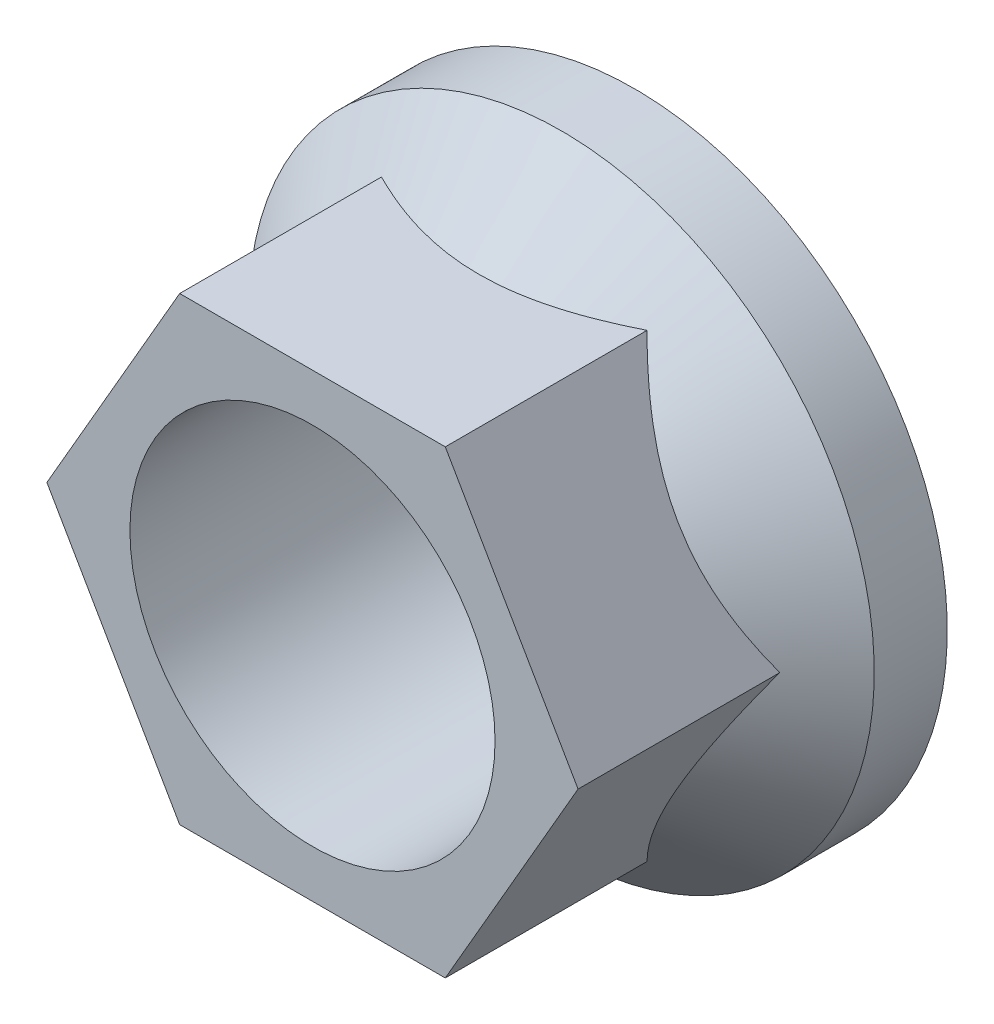
ISO-10303-21;
HEADER;
FILE_DESCRIPTION(('STEP AP214'),'2;1');
FILE_NAME('part.step','',(''),(''),'','','');
FILE_SCHEMA(('AUTOMOTIVE_DESIGN { 1 0 10303 214 1 1 1 1 }'));
ENDSEC;
DATA;
#1=APPLICATION_CONTEXT('core data for automotive mechanical design processes');
#2=APPLICATION_PROTOCOL_DEFINITION('international standard','automotive_design',2000,#1);
#3=PRODUCT_CONTEXT('',#1,'mechanical');
#4=PRODUCT('Part','Part','',(#3));
#5=PRODUCT_RELATED_PRODUCT_CATEGORY('part','',(#4));
#6=PRODUCT_DEFINITION_FORMATION('','',#4);
#7=PRODUCT_DEFINITION_CONTEXT('part definition',#1,'design');
#8=PRODUCT_DEFINITION('design','',#6,#7);
#9=PRODUCT_DEFINITION_SHAPE('','',#8);
#10=(LENGTH_UNIT() NAMED_UNIT(*) SI_UNIT(.MILLI.,.METRE.));
#11=(NAMED_UNIT(*) PLANE_ANGLE_UNIT() SI_UNIT($,.RADIAN.));
#12=(NAMED_UNIT(*) SI_UNIT($,.STERADIAN.) SOLID_ANGLE_UNIT());
#13=UNCERTAINTY_MEASURE_WITH_UNIT(LENGTH_MEASURE(1.E-05),#10,'distance_accuracy_value','');
#14=(GEOMETRIC_REPRESENTATION_CONTEXT(3) GLOBAL_UNCERTAINTY_ASSIGNED_CONTEXT((#13)) GLOBAL_UNIT_ASSIGNED_CONTEXT((#10,
#11,#12)) REPRESENTATION_CONTEXT('',''));
#15=CARTESIAN_POINT('',(0.,0.,0.));
#16=DIRECTION('',(0.,0.,1.));
#17=DIRECTION('',(1.,0.,0.));
#18=AXIS2_PLACEMENT_3D('',#15,#16,#17);
#19=CARTESIAN_POINT('',(0.,3.96875,7.));
#20=DIRECTION('',(0.,0.,1.));
#21=DIRECTION('',(1.,0.,0.));
#22=AXIS2_PLACEMENT_3D('',#19,#20,#21);
#23=PLANE('',#22);
#24=CARTESIAN_POINT('',(0.,0.,7.));
#25=DIRECTION('',(0.,0.,-1.));
#26=DIRECTION('',(-1.,0.,0.));
#27=AXIS2_PLACEMENT_3D('',#24,#25,#26);
#28=CIRCLE('',#27,3.96875);
#29=CARTESIAN_POINT('',(-3.96875,0.,7.));
#30=VERTEX_POINT('',#29);
#31=EDGE_CURVE('E134',#30,#30,#28,.T.);
#32=ORIENTED_EDGE('',*,*,#31,.T.);
#33=EDGE_LOOP('',(#32));
#34=FACE_BOUND('',#33,.T.);
#35=DIRECTION('',(-1.,0.,0.));
#36=VECTOR('',#35,1.);
#37=CARTESIAN_POINT('',(2.88675134594813,5.,7.));
#38=LINE('',#37,#36);
#39=CARTESIAN_POINT('',(2.88675134594813,5.,7.));
#40=VERTEX_POINT('',#39);
#41=CARTESIAN_POINT('',(-2.88675134594813,5.,7.));
#42=VERTEX_POINT('',#41);
#43=EDGE_CURVE('E90',#40,#42,#38,.T.);
#44=ORIENTED_EDGE('',*,*,#43,.T.);
#45=DIRECTION('',(-0.5,-0.866025403784439,0.));
#46=VECTOR('',#45,1.);
#47=CARTESIAN_POINT('',(-2.88675134594813,5.,7.));
#48=LINE('',#47,#46);
#49=CARTESIAN_POINT('',(-5.77350269189626,0.,7.));
#50=VERTEX_POINT('',#49);
#51=EDGE_CURVE('E99',#42,#50,#48,.T.);
#52=ORIENTED_EDGE('',*,*,#51,.T.);
#53=DIRECTION('',(0.5,-0.866025403784439,0.));
#54=VECTOR('',#53,1.);
#55=CARTESIAN_POINT('',(-5.77350269189626,0.,7.));
#56=LINE('',#55,#54);
#57=CARTESIAN_POINT('',(-2.88675134594813,-5.,7.));
#58=VERTEX_POINT('',#57);
#59=EDGE_CURVE('E104',#50,#58,#56,.T.);
#60=ORIENTED_EDGE('',*,*,#59,.T.);
#61=DIRECTION('',(1.,0.,0.));
#62=VECTOR('',#61,1.);
#63=CARTESIAN_POINT('',(-2.88675134594813,-5.,7.));
#64=LINE('',#63,#62);
#65=CARTESIAN_POINT('',(2.88675134594813,-5.,7.));
#66=VERTEX_POINT('',#65);
#67=EDGE_CURVE('E119',#58,#66,#64,.T.);
#68=ORIENTED_EDGE('',*,*,#67,.T.);
#69=DIRECTION('',(0.5,0.866025403784439,0.));
#70=VECTOR('',#69,1.);
#71=CARTESIAN_POINT('',(2.88675134594813,-5.,7.));
#72=LINE('',#71,#70);
#73=CARTESIAN_POINT('',(5.77350269189626,0.,7.));
#74=VERTEX_POINT('',#73);
#75=EDGE_CURVE('E122',#66,#74,#72,.T.);
#76=ORIENTED_EDGE('',*,*,#75,.T.);
#77=DIRECTION('',(-0.5,0.866025403784439,0.));
#78=VECTOR('',#77,1.);
#79=CARTESIAN_POINT('',(5.77350269189626,0.,7.));
#80=LINE('',#79,#78);
#81=EDGE_CURVE('E96',#74,#40,#80,.T.);
#82=ORIENTED_EDGE('',*,*,#81,.T.);
#83=EDGE_LOOP('',(#44,#52,#60,#68,#76,#82));
#84=FACE_BOUND('',#83,.T.);
#85=ADVANCED_FACE('F34',(#34,#84),#23,.T.);
#86=CARTESIAN_POINT('',(0.,0.,1.5875));
#87=DIRECTION('',(0.,0.,-1.));
#88=DIRECTION('',(-1.,0.,0.));
#89=AXIS2_PLACEMENT_3D('',#86,#87,#88);
#90=CONICAL_SURFACE('',#89,6.8,0.78539816339745);
#91=CARTESIAN_POINT('',(-5.7736181619501,-0.00019999999999992,2.61388183458587));
#92=CARTESIAN_POINT('',(-5.72398176110226,0.0857727681733075,2.66351376249948));
#93=CARTESIAN_POINT('',(-5.6739638280717,0.172406369471809,2.71162258281683));
#94=CARTESIAN_POINT('',(-5.57309004377304,0.34712488902884,2.80433067677396));
#95=CARTESIAN_POINT('',(-5.5222337529357,0.43521056864361,2.84892803360225));
#96=CARTESIAN_POINT('',(-5.367822577439,0.702658569860331,2.97713823597548));
#97=CARTESIAN_POINT('',(-5.26296050943972,0.88428499942183,3.05462224260221));
#98=CARTESIAN_POINT('',(-5.05149774994706,1.25054924277183,3.18730836367822));
#99=CARTESIAN_POINT('',(-4.94495110937142,1.43509343762461,3.2428447674579));
#100=CARTESIAN_POINT('',(-4.78337944338746,1.71494377217238,3.30708681405622));
#101=CARTESIAN_POINT('',(-4.72928433986568,1.8086392399128,3.3253151447651));
#102=CARTESIAN_POINT('',(-4.6206360917956,1.99682352572354,3.35500512097761));
#103=CARTESIAN_POINT('',(-4.56608301694086,2.09131222308106,3.36646777779865));
#104=CARTESIAN_POINT('',(-4.43314578685873,2.32156625980078,3.38568644635775));
#105=CARTESIAN_POINT('',(-4.35461839928598,2.45757968486243,3.38971901984402));
#106=CARTESIAN_POINT('',(-4.19770514602325,2.7293614118944,3.38295145399842));
#107=CARTESIAN_POINT('',(-4.11931933958609,2.86512961123583,3.37214611513274));
#108=CARTESIAN_POINT('',(-3.9632867222645,3.13538603207476,3.33633965820569));
#109=CARTESIAN_POINT('',(-3.88564083675503,3.26987265077585,3.31132266414547));
#110=CARTESIAN_POINT('',(-3.73168360440634,3.53653439939647,3.2484529831143));
#111=CARTESIAN_POINT('',(-3.65537215571135,3.66870970573538,3.21060128033617));
#112=CARTESIAN_POINT('',(-3.51990355411976,3.90334820652232,3.13272742134319));
#113=CARTESIAN_POINT('',(-3.46044647368859,4.0063308906988,3.09475305768471));
#114=CARTESIAN_POINT('',(-3.34259967462161,4.21044753419218,3.01268468192979));
#115=CARTESIAN_POINT('',(-3.28420998845894,4.31158143726392,2.96859048400018));
#116=CARTESIAN_POINT('',(-3.16868188148908,4.51168198823798,2.87527092275137));
#117=CARTESIAN_POINT('',(-3.11154017495448,4.61065432718709,2.82606169539434));
#118=CARTESIAN_POINT('',(-2.99831490663731,4.80676624461304,2.72315818526073));
#119=CARTESIAN_POINT('',(-2.94223072132829,4.90390690306938,2.66946665355471));
#120=CARTESIAN_POINT('',(-2.88663587589429,5.0002,2.61388183458587));
#121=B_SPLINE_CURVE_WITH_KNOTS('',3,(#91,#92,#93,#94,#95,#96,#97,#98,#99,#100,#101,#102,#103,
#104,#105,#106,#107,#108,#109,#110,#111,#112,#113,#114,#115,#116,#117,#118,#119,#120),
.UNSPECIFIED.,.F.,.F.,(4,2,2,2,2,2,2,2,2,2,2,2,2,2,4),(0.,0.332945616209568,0.666071736106991,
1.33592065243334,1.99513262597482,2.32409207808824,2.65300234563691,3.12358963991984,
3.59434188052354,4.06562104077027,4.53686407049611,4.91117956742317,5.2855064331967,
5.65868635377115,6.03163889109472),.UNSPECIFIED.);
#122=CARTESIAN_POINT('',(-5.77350269189626,0.,2.61399730810374));
#123=VERTEX_POINT('',#122);
#124=CARTESIAN_POINT('',(-2.88675134594813,5.,2.61399730810374));
#125=VERTEX_POINT('',#124);
#126=EDGE_CURVE('E138',#123,#125,#121,.T.);
#127=ORIENTED_EDGE('',*,*,#126,.T.);
#128=CARTESIAN_POINT('',(-7.20684268333673,5.,-0.383964043269181));
#129=CARTESIAN_POINT('',(-7.02533584783272,5.,-0.234871602398767));
#130=CARTESIAN_POINT('',(-6.84295884941852,5.,-0.0868218638032089));
#131=CARTESIAN_POINT('',(-6.47601907638765,5.,0.206637299933018));
#132=CARTESIAN_POINT('',(-6.29145575829076,5.,0.35204604480556));
#133=CARTESIAN_POINT('',(-5.91774347662376,5.,0.641175063616988));
#134=CARTESIAN_POINT('',(-5.72856639729863,5.,0.784859115566647));
#135=CARTESIAN_POINT('',(-5.34709488465153,5.,1.06800052762655));
#136=CARTESIAN_POINT('',(-5.15480075670416,5.,1.20745829798645));
#137=CARTESIAN_POINT('',(-4.74828785789455,5.,1.49377203808166));
#138=CARTESIAN_POINT('',(-4.53369778406278,5.,1.64010380565186));
#139=CARTESIAN_POINT('',(-4.09882280903799,5.,1.92427880652764));
#140=CARTESIAN_POINT('',(-3.87853606185851,5.,2.06211923804332));
#141=CARTESIAN_POINT('',(-3.43208969458754,5.,2.32557885644554));
#142=CARTESIAN_POINT('',(-3.20596216087672,5.,2.45125191150979));
#143=CARTESIAN_POINT('',(-2.7456402336395,5.,2.68667066325972));
#144=CARTESIAN_POINT('',(-2.51145309302816,5.,2.79643023966708));
#145=CARTESIAN_POINT('',(-2.10332797090163,5.,2.96529770024876));
#146=CARTESIAN_POINT('',(-1.93166126919297,5.,3.02985543617625));
#147=CARTESIAN_POINT('',(-1.5836731379951,5.,3.14525890409372));
#148=CARTESIAN_POINT('',(-1.40735104713127,5.,3.1961026761562));
#149=CARTESIAN_POINT('',(-1.05421412357262,5.,3.28038821967951));
#150=CARTESIAN_POINT('',(-0.877478089032206,5.,3.31415444612165));
#151=CARTESIAN_POINT('',(-0.521464449999362,5.,3.36346766636841));
#152=CARTESIAN_POINT('',(-0.342187457595268,5.,3.37901897491136));
#153=CARTESIAN_POINT('',(0.00824609668831101,5.,3.39041051498121));
#154=CARTESIAN_POINT('',(0.179372606687934,5.,3.38717443039007));
#155=CARTESIAN_POINT('',(0.520399004844326,5.,3.36337145447053));
#156=CARTESIAN_POINT('',(0.690298849003054,5.,3.34280394458272));
#157=CARTESIAN_POINT('',(1.0287130005671,5.,3.28552175283438));
#158=CARTESIAN_POINT('',(1.19720505930835,5.,3.24867809251528));
#159=CARTESIAN_POINT('',(1.53047572651633,5.,3.16098339628438));
#160=CARTESIAN_POINT('',(1.69525363009853,5.,3.11012972532152));
#161=CARTESIAN_POINT('',(2.02014513075725,5.,2.99696570970446));
#162=CARTESIAN_POINT('',(2.18027266869218,5.,2.93469486248416));
#163=CARTESIAN_POINT('',(2.49655833978531,5.,2.80070603826635));
#164=CARTESIAN_POINT('',(2.65271487839687,5.,2.72898433558749));
#165=CARTESIAN_POINT('',(2.96150057332792,5.,2.57782421611012));
#166=CARTESIAN_POINT('',(3.11412423256131,5.,2.49837465894926));
#167=CARTESIAN_POINT('',(3.41597100743156,5.,2.33333668834199));
#168=CARTESIAN_POINT('',(3.5651945226723,5.,2.24774900123765));
#169=CARTESIAN_POINT('',(3.86264486278974,5.,2.07041370144223));
#170=CARTESIAN_POINT('',(4.01083137662813,5.,1.9785987896325));
#171=CARTESIAN_POINT('',(4.30453975295172,5.,1.79081021954944));
#172=CARTESIAN_POINT('',(4.450061554748,5.,1.69483646672549));
#173=CARTESIAN_POINT('',(4.73865434683265,5.,1.49957076621414));
#174=CARTESIAN_POINT('',(4.88172752266474,5.,1.40028203909378));
#175=CARTESIAN_POINT('',(5.16586578389749,5.,1.19888884074802));
#176=CARTESIAN_POINT('',(5.30693093866263,5.,1.0967844671451));
#177=CARTESIAN_POINT('',(5.59870626887491,5.,0.881835473508126));
#178=CARTESIAN_POINT('',(5.74926965373197,5.,0.768791903592957));
#179=CARTESIAN_POINT('',(6.04864866788352,5.,0.540411100317346));
#180=CARTESIAN_POINT('',(6.19746425249832,5.,0.425073808523728));
#181=CARTESIAN_POINT('',(6.64168716046466,5.,0.0761658869699936));
#182=CARTESIAN_POINT('',(6.93483878765855,5.,-0.160277077832388));
#183=CARTESIAN_POINT('',(7.5167127425952,5.,-0.638776003833525));
#184=CARTESIAN_POINT('',(7.8054330793097,5.,-0.880834372114013));
#185=CARTESIAN_POINT('',(8.37936241548021,5.,-1.36908626381488));
#186=CARTESIAN_POINT('',(8.66457132332548,5.,-1.61527989472686));
#187=CARTESIAN_POINT('',(9.23282971432231,5.,-2.11135330652402));
#188=CARTESIAN_POINT('',(9.51587331080528,5.,-2.36123981658115));
#189=CARTESIAN_POINT('',(10.0797503356248,5.,-2.86349804759497));
#190=CARTESIAN_POINT('',(10.3605837365856,5.,-3.11586979924743));
#191=CARTESIAN_POINT('',(10.920382245605,5.,-3.62252028115007));
#192=CARTESIAN_POINT('',(11.1993478479639,5.,-3.87679846579686));
#193=CARTESIAN_POINT('',(11.755810505856,5.,-4.38695739484843));
#194=CARTESIAN_POINT('',(12.0333075558994,5.,-4.64283814523622));
#195=CARTESIAN_POINT('',(12.8012247838068,5.,-5.35429995427943));
#196=CARTESIAN_POINT('',(13.2903452503295,5.,-5.81128360107441));
#197=CARTESIAN_POINT('',(14.2658249043522,5.,-6.7282608026559));
#198=CARTESIAN_POINT('',(14.7521838690041,5.,-7.18825459408499));
#199=CARTESIAN_POINT('',(15.7208582314195,5.,-8.10863801113465));
#200=CARTESIAN_POINT('',(16.2031820166547,5.,-8.56901881612833));
#201=CARTESIAN_POINT('',(17.1661285582923,5.,-9.4914643599497));
#202=CARTESIAN_POINT('',(17.6467514732382,5.,-9.95352893321876));
#203=CARTESIAN_POINT('',(18.1267697042408,5.,-10.4162171833279));
#204=B_SPLINE_CURVE_WITH_KNOTS('',3,(#128,#129,#130,#131,#132,#133,#134,#135,#136,#137,#138,
#139,#140,#141,#142,#143,#144,#145,#146,#147,#148,#149,#150,#151,#152,#153,#154,#155,#156,#157,
#158,#159,#160,#161,#162,#163,#164,#165,#166,#167,#168,#169,#170,#171,#172,#173,#174,#175,#176,
#177,#178,#179,#180,#181,#182,#183,#184,#185,#186,#187,#188,#189,#190,#191,#192,#193,#194,#195,
#196,#197,#198,#199,#200,#201,#202,#203),.UNSPECIFIED.,.F.,.F.,(4,2,2,2,2,2,2,2,2,2,2,2,2,2,2,2,
2,2,2,2,2,2,2,2,2,2,2,2,2,2,2,2,2,2,2,2,2,4),(0.,0.704681621091579,1.40954225127929,
2.12216418418013,2.83471671908357,3.61376913385487,4.39307724186671,5.16876015340873,
5.94376239165213,6.4935186872698,7.04335350958292,7.58230774197345,8.12113428138719,
8.63370109577989,9.14628620448172,9.66300820682658,10.1798274624543,10.6948914210485,
11.210159037123,11.7261807862798,12.2421415735738,12.765032827809,13.2879359761415,
13.8103451056244,14.3327361451554,14.8975398871074,15.4623580360636,16.5921134146673,
17.7223623617099,18.8526407339384,19.9853242974614,21.1180218685947,22.25040678606,
23.3827959336859,25.3909239343666,27.3992117474587,29.3995270305069,31.3996506691803),.UNSPECIFIED.);
#205=CARTESIAN_POINT('',(2.88675134594813,5.,2.61399730810374));
#206=VERTEX_POINT('',#205);
#207=EDGE_CURVE('E92',#125,#206,#204,.T.);
#208=ORIENTED_EDGE('',*,*,#207,.T.);
#209=CARTESIAN_POINT('',(2.88663587589429,5.0002,2.61388183458587));
#210=CARTESIAN_POINT('',(2.93627227674213,4.91422723182669,2.66351376249948));
#211=CARTESIAN_POINT('',(2.98629020977269,4.82759363052819,2.71162258281683));
#212=CARTESIAN_POINT('',(3.08716399407135,4.65287511097116,2.80433067677396));
#213=CARTESIAN_POINT('',(3.13802028490869,4.56478943135639,2.84892803360225));
#214=CARTESIAN_POINT('',(3.29243146040539,4.29734143013967,2.97713823597548));
#215=CARTESIAN_POINT('',(3.39729352840467,4.11571500057817,3.05462224260221));
#216=CARTESIAN_POINT('',(3.60875628789733,3.74945075722818,3.18730836367822));
#217=CARTESIAN_POINT('',(3.71530292847296,3.56490656237539,3.2428447674579));
#218=CARTESIAN_POINT('',(3.87687459445693,3.28505622782762,3.30708681405622));
#219=CARTESIAN_POINT('',(3.93096969797871,3.1913607600872,3.3253151447651));
#220=CARTESIAN_POINT('',(4.03961794604879,3.00317647427647,3.35500512097761));
#221=CARTESIAN_POINT('',(4.09417102090353,2.90868777691895,3.36646777779865));
#222=CARTESIAN_POINT('',(4.22710825098566,2.67843374019922,3.38568644635775));
#223=CARTESIAN_POINT('',(4.30563563855841,2.54242031513757,3.38971901984402));
#224=CARTESIAN_POINT('',(4.46254889182114,2.2706385881056,3.38295145399842));
#225=CARTESIAN_POINT('',(4.5409346982583,2.13487038876417,3.37214611513273));
#226=CARTESIAN_POINT('',(4.69696731557988,1.86461396792524,3.33633965820569));
#227=CARTESIAN_POINT('',(4.77461320108936,1.73012734922415,3.31132266414547));
#228=CARTESIAN_POINT('',(4.92857043343805,1.46346560060353,3.2484529831143));
#229=CARTESIAN_POINT('',(5.00488188213304,1.33129029426463,3.21060128033617));
#230=CARTESIAN_POINT('',(5.14035048372463,1.09665179347768,3.13272742134319));
#231=CARTESIAN_POINT('',(5.1998075641558,0.993669109301201,3.09475305768471));
#232=CARTESIAN_POINT('',(5.31765436322278,0.789552465807827,3.01268468192979));
#233=CARTESIAN_POINT('',(5.37604404938545,0.688418562736079,2.96859048400018));
#234=CARTESIAN_POINT('',(5.49157215635531,0.488318011762025,2.87527092275137));
#235=CARTESIAN_POINT('',(5.54871386288991,0.389345672812909,2.82606169539434));
#236=CARTESIAN_POINT('',(5.66193913120708,0.193233755386958,2.72315818526073));
#237=CARTESIAN_POINT('',(5.7180233165161,0.0960930969306195,2.66946665355471));
#238=CARTESIAN_POINT('',(5.7736181619501,-0.000199999999998285,2.61388183458587));
#239=B_SPLINE_CURVE_WITH_KNOTS('',3,(#209,#210,#211,#212,#213,#214,#215,#216,#217,#218,#219,
#220,#221,#222,#223,#224,#225,#226,#227,#228,#229,#230,#231,#232,#233,#234,#235,#236,#237,#238),
.UNSPECIFIED.,.F.,.F.,(4,2,2,2,2,2,2,2,2,2,2,2,2,2,4),(0.,0.332945616209567,0.666071736106991,
1.33592065243334,1.99513262597481,2.32409207808824,2.65300234563691,3.12358963991983,
3.59434188052354,4.06562104077027,4.53686407049611,4.91117956742317,5.2855064331967,
5.65868635377115,6.03163889109472),.UNSPECIFIED.);
#240=CARTESIAN_POINT('',(5.77350269189626,0.,2.61399730810374));
#241=VERTEX_POINT('',#240);
#242=EDGE_CURVE('E209',#206,#241,#239,.T.);
#243=ORIENTED_EDGE('',*,*,#242,.T.);
#244=CARTESIAN_POINT('',(5.7736181619501,0.000200000000001849,2.61388183458587));
#245=CARTESIAN_POINT('',(5.72398176110226,-0.0857727681733054,2.66351376249948));
#246=CARTESIAN_POINT('',(5.6739638280717,-0.172406369471807,2.71162258281683));
#247=CARTESIAN_POINT('',(5.57309004377304,-0.347124889028838,2.80433067677396));
#248=CARTESIAN_POINT('',(5.5222337529357,-0.435210568643608,2.84892803360225));
#249=CARTESIAN_POINT('',(5.367822577439,-0.702658569860329,2.97713823597548));
#250=CARTESIAN_POINT('',(5.26296050943972,-0.884284999421828,3.05462224260222));
#251=CARTESIAN_POINT('',(5.05149774994706,-1.25054924277182,3.18730836367822));
#252=CARTESIAN_POINT('',(4.94495110937142,-1.43509343762461,3.2428447674579));
#253=CARTESIAN_POINT('',(4.78337944338746,-1.71494377217238,3.30708681405622));
#254=CARTESIAN_POINT('',(4.72928433986568,-1.8086392399128,3.3253151447651));
#255=CARTESIAN_POINT('',(4.6206360917956,-1.99682352572353,3.35500512097761));
#256=CARTESIAN_POINT('',(4.56608301694086,-2.09131222308105,3.36646777779865));
#257=CARTESIAN_POINT('',(4.43314578685873,-2.32156625980078,3.38568644635775));
#258=CARTESIAN_POINT('',(4.35461839928598,-2.45757968486243,3.38971901984402));
#259=CARTESIAN_POINT('',(4.19770514602325,-2.7293614118944,3.38295145399842));
#260=CARTESIAN_POINT('',(4.11931933958609,-2.86512961123582,3.37214611513274));
#261=CARTESIAN_POINT('',(3.9632867222645,-3.13538603207476,3.3363396582057));
#262=CARTESIAN_POINT('',(3.88564083675503,-3.26987265077584,3.31132266414547));
#263=CARTESIAN_POINT('',(3.73168360440634,-3.53653439939646,3.2484529831143));
#264=CARTESIAN_POINT('',(3.65537215571135,-3.66870970573537,3.21060128033617));
#265=CARTESIAN_POINT('',(3.51990355411976,-3.90334820652231,3.1327274213432));
#266=CARTESIAN_POINT('',(3.46044647368859,-4.0063308906988,3.09475305768472));
#267=CARTESIAN_POINT('',(3.34259967462161,-4.21044753419217,3.01268468192979));
#268=CARTESIAN_POINT('',(3.28420998845894,-4.31158143726392,2.96859048400018));
#269=CARTESIAN_POINT('',(3.16868188148908,-4.51168198823797,2.87527092275137));
#270=CARTESIAN_POINT('',(3.11154017495448,-4.61065432718709,2.82606169539434));
#271=CARTESIAN_POINT('',(2.99831490663731,-4.80676624461304,2.72315818526073));
#272=CARTESIAN_POINT('',(2.94223072132829,-4.90390690306938,2.66946665355472));
#273=CARTESIAN_POINT('',(2.88663587589429,-5.0002,2.61388183458587));
#274=B_SPLINE_CURVE_WITH_KNOTS('',3,(#244,#245,#246,#247,#248,#249,#250,#251,#252,#253,#254,
#255,#256,#257,#258,#259,#260,#261,#262,#263,#264,#265,#266,#267,#268,#269,#270,#271,#272,#273),
.UNSPECIFIED.,.F.,.F.,(4,2,2,2,2,2,2,2,2,2,2,2,2,2,4),(0.,0.332945616209569,0.666071736106992,
1.33592065243334,1.99513262597482,2.32409207808824,2.65300234563691,3.12358963991983,
3.59434188052354,4.06562104077027,4.53686407049611,4.91117956742317,5.2855064331967,
5.65868635377115,6.03163889109472),.UNSPECIFIED.);
#275=CARTESIAN_POINT('',(2.88675134594813,-5.,2.61399730810374));
#276=VERTEX_POINT('',#275);
#277=EDGE_CURVE('E204',#241,#276,#274,.T.);
#278=ORIENTED_EDGE('',*,*,#277,.T.);
#279=CARTESIAN_POINT('',(-7.20684268333675,-5.,-0.383964043269188));
#280=CARTESIAN_POINT('',(-7.02533584783273,-5.,-0.234871602398773));
#281=CARTESIAN_POINT('',(-6.84295884941853,-5.,-0.0868218638032146));
#282=CARTESIAN_POINT('',(-6.47601907638766,-5.,0.206637299933013));
#283=CARTESIAN_POINT('',(-6.29145575829077,-5.,0.352046044805554));
#284=CARTESIAN_POINT('',(-5.91774347662377,-5.,0.641175063616982));
#285=CARTESIAN_POINT('',(-5.72856639729864,-5.,0.784859115566641));
#286=CARTESIAN_POINT('',(-5.34709488465154,-5.,1.06800052762655));
#287=CARTESIAN_POINT('',(-5.15480075670417,-5.,1.20745829798645));
#288=CARTESIAN_POINT('',(-4.74828785789456,-5.,1.49377203808166));
#289=CARTESIAN_POINT('',(-4.53369778406279,-5.,1.64010380565186));
#290=CARTESIAN_POINT('',(-4.098822809038,-5.,1.92427880652763));
#291=CARTESIAN_POINT('',(-3.87853606185852,-5.,2.06211923804332));
#292=CARTESIAN_POINT('',(-3.43208969458754,-5.,2.32557885644554));
#293=CARTESIAN_POINT('',(-3.20596216087672,-5.,2.45125191150979));
#294=CARTESIAN_POINT('',(-2.7456402336395,-5.,2.68667066325972));
#295=CARTESIAN_POINT('',(-2.51145309302817,-5.,2.79643023966708));
#296=CARTESIAN_POINT('',(-2.10332797090163,-5.,2.96529770024877));
#297=CARTESIAN_POINT('',(-1.93166126919298,-5.,3.02985543617625));
#298=CARTESIAN_POINT('',(-1.58367313799511,-5.,3.14525890409372));
#299=CARTESIAN_POINT('',(-1.40735104713128,-5.,3.1961026761562));
#300=CARTESIAN_POINT('',(-1.05421412357263,-5.,3.28038821967951));
#301=CARTESIAN_POINT('',(-0.877478089032207,-5.,3.31415444612165));
#302=CARTESIAN_POINT('',(-0.521464449999363,-5.,3.36346766636841));
#303=CARTESIAN_POINT('',(-0.342187457595268,-5.,3.37901897491137));
#304=CARTESIAN_POINT('',(0.00824609668830992,-5.,3.39041051498121));
#305=CARTESIAN_POINT('',(0.179372606687932,-5.,3.38717443039007));
#306=CARTESIAN_POINT('',(0.520399004844325,-5.,3.36337145447053));
#307=CARTESIAN_POINT('',(0.690298849003052,-5.,3.34280394458273));
#308=CARTESIAN_POINT('',(1.0287130005671,-5.,3.28552175283439));
#309=CARTESIAN_POINT('',(1.19720505930835,-5.,3.24867809251528));
#310=CARTESIAN_POINT('',(1.53047572651633,-5.,3.16098339628438));
#311=CARTESIAN_POINT('',(1.69525363009853,-5.,3.11012972532153));
#312=CARTESIAN_POINT('',(2.02014513075725,-5.,2.99696570970446));
#313=CARTESIAN_POINT('',(2.18027266869218,-5.,2.93469486248417));
#314=CARTESIAN_POINT('',(2.49655833978531,-5.,2.80070603826635));
#315=CARTESIAN_POINT('',(2.65271487839687,-5.,2.72898433558749));
#316=CARTESIAN_POINT('',(2.96150057332792,-5.,2.57782421611012));
#317=CARTESIAN_POINT('',(3.11412423256131,-5.,2.49837465894926));
#318=CARTESIAN_POINT('',(3.41597100743156,-5.,2.33333668834199));
#319=CARTESIAN_POINT('',(3.5651945226723,-5.,2.24774900123765));
#320=CARTESIAN_POINT('',(3.86264486278974,-5.,2.07041370144224));
#321=CARTESIAN_POINT('',(4.01083137662813,-5.,1.9785987896325));
#322=CARTESIAN_POINT('',(4.30453975295172,-5.,1.79081021954945));
#323=CARTESIAN_POINT('',(4.45006155474799,-5.,1.6948364667255));
#324=CARTESIAN_POINT('',(4.73865434683265,-5.,1.49957076621414));
#325=CARTESIAN_POINT('',(4.88172752266473,-5.,1.40028203909378));
#326=CARTESIAN_POINT('',(5.16586578389748,-5.,1.19888884074802));
#327=CARTESIAN_POINT('',(5.30693093866263,-5.,1.09678446714511));
#328=CARTESIAN_POINT('',(5.59870626887491,-5.,0.881835473508129));
#329=CARTESIAN_POINT('',(5.74926965373197,-5.,0.76879190359296));
#330=CARTESIAN_POINT('',(6.04864866788352,-5.,0.540411100317349));
#331=CARTESIAN_POINT('',(6.19746425249832,-5.,0.425073808523731));
#332=CARTESIAN_POINT('',(6.64168716046466,-5.,0.0761658869699972));
#333=CARTESIAN_POINT('',(6.93483878765855,-5.,-0.160277077832384));
#334=CARTESIAN_POINT('',(7.51671274259519,-5.,-0.63877600383352));
#335=CARTESIAN_POINT('',(7.8054330793097,-5.,-0.880834372114009));
#336=CARTESIAN_POINT('',(8.3793624154802,-5.,-1.36908626381487));
#337=CARTESIAN_POINT('',(8.66457132332548,-5.,-1.61527989472686));
#338=CARTESIAN_POINT('',(9.23282971432231,-5.,-2.11135330652402));
#339=CARTESIAN_POINT('',(9.51587331080528,-5.,-2.36123981658114));
#340=CARTESIAN_POINT('',(10.0797503356248,-5.,-2.86349804759497));
#341=CARTESIAN_POINT('',(10.3605837365856,-5.,-3.11586979924742));
#342=CARTESIAN_POINT('',(10.920382245605,-5.,-3.62252028115007));
#343=CARTESIAN_POINT('',(11.1993478479639,-5.,-3.87679846579686));
#344=CARTESIAN_POINT('',(11.755810505856,-5.,-4.38695739484843));
#345=CARTESIAN_POINT('',(12.0333075558994,-5.,-4.64283814523622));
#346=CARTESIAN_POINT('',(12.8012247838068,-5.,-5.35429995427942));
#347=CARTESIAN_POINT('',(13.2903452503295,-5.,-5.8112836010744));
#348=CARTESIAN_POINT('',(14.2658249043522,-5.,-6.72826080265589));
#349=CARTESIAN_POINT('',(14.7521838690041,-5.,-7.18825459408498));
#350=CARTESIAN_POINT('',(15.7208582314195,-5.,-8.10863801113464));
#351=CARTESIAN_POINT('',(16.2031820166547,-5.,-8.56901881612833));
#352=CARTESIAN_POINT('',(17.1661285582923,-5.,-9.4914643599497));
#353=CARTESIAN_POINT('',(17.6467514732382,-5.,-9.95352893321876));
#354=CARTESIAN_POINT('',(18.1267697042408,-5.,-10.4162171833279));
#355=B_SPLINE_CURVE_WITH_KNOTS('',3,(#279,#280,#281,#282,#283,#284,#285,#286,#287,#288,#289,
#290,#291,#292,#293,#294,#295,#296,#297,#298,#299,#300,#301,#302,#303,#304,#305,#306,#307,#308,
#309,#310,#311,#312,#313,#314,#315,#316,#317,#318,#319,#320,#321,#322,#323,#324,#325,#326,#327,
#328,#329,#330,#331,#332,#333,#334,#335,#336,#337,#338,#339,#340,#341,#342,#343,#344,#345,#346,
#347,#348,#349,#350,#351,#352,#353,#354),.UNSPECIFIED.,.F.,.F.,(4,2,2,2,2,2,2,2,2,2,2,2,2,2,2,2,
2,2,2,2,2,2,2,2,2,2,2,2,2,2,2,2,2,2,2,2,2,4),(0.,0.70468162109158,1.40954225127929,
2.12216418418014,2.83471671908358,3.61376913385488,4.39307724186672,5.16876015340874,
5.94376239165214,6.49351868726981,7.04335350958293,7.58230774197346,8.1211342813872,
8.63370109577991,9.14628620448173,9.66300820682659,10.1798274624543,10.6948914210486,
11.210159037123,11.7261807862798,12.2421415735739,12.765032827809,13.2879359761415,
13.8103451056244,14.3327361451554,14.8975398871074,15.4623580360636,16.5921134146674,
17.7223623617099,18.8526407339384,19.9853242974614,21.1180218685947,22.25040678606,
23.382795933686,25.3909239343666,27.3992117474587,29.3995270305069,31.3996506691803),.UNSPECIFIED.);
#356=CARTESIAN_POINT('',(-2.88675134594813,-5.,2.61399730810374));
#357=VERTEX_POINT('',#356);
#358=EDGE_CURVE('E53',#276,#357,#355,.F.);
#359=ORIENTED_EDGE('',*,*,#358,.T.);
#360=CARTESIAN_POINT('',(-2.8866358758943,-5.0002,2.61388183458587));
#361=CARTESIAN_POINT('',(-2.93627227674213,-4.91422723182669,2.66351376249948));
#362=CARTESIAN_POINT('',(-2.98629020977269,-4.82759363052819,2.71162258281683));
#363=CARTESIAN_POINT('',(-3.08716399407135,-4.65287511097116,2.80433067677396));
#364=CARTESIAN_POINT('',(-3.13802028490869,-4.56478943135639,2.84892803360225));
#365=CARTESIAN_POINT('',(-3.29243146040539,-4.29734143013967,2.97713823597548));
#366=CARTESIAN_POINT('',(-3.39729352840467,-4.11571500057817,3.05462224260221));
#367=CARTESIAN_POINT('',(-3.60875628789733,-3.74945075722818,3.18730836367822));
#368=CARTESIAN_POINT('',(-3.71530292847296,-3.56490656237539,3.2428447674579));
#369=CARTESIAN_POINT('',(-3.87687459445692,-3.28505622782762,3.30708681405622));
#370=CARTESIAN_POINT('',(-3.9309696979787,-3.1913607600872,3.3253151447651));
#371=CARTESIAN_POINT('',(-4.03961794604879,-3.00317647427647,3.35500512097761));
#372=CARTESIAN_POINT('',(-4.09417102090353,-2.90868777691895,3.36646777779865));
#373=CARTESIAN_POINT('',(-4.22710825098566,-2.67843374019922,3.38568644635775));
#374=CARTESIAN_POINT('',(-4.30563563855841,-2.54242031513757,3.38971901984402));
#375=CARTESIAN_POINT('',(-4.46254889182114,-2.27063858810561,3.38295145399842));
#376=CARTESIAN_POINT('',(-4.5409346982583,-2.13487038876418,3.37214611513273));
#377=CARTESIAN_POINT('',(-4.69696731557988,-1.86461396792525,3.33633965820569));
#378=CARTESIAN_POINT('',(-4.77461320108936,-1.73012734922416,3.31132266414547));
#379=CARTESIAN_POINT('',(-4.92857043343805,-1.46346560060354,3.2484529831143));
#380=CARTESIAN_POINT('',(-5.00488188213304,-1.33129029426463,3.21060128033617));
#381=CARTESIAN_POINT('',(-5.14035048372463,-1.09665179347769,3.13272742134319));
#382=CARTESIAN_POINT('',(-5.19980756415579,-0.993669109301204,3.09475305768471));
#383=CARTESIAN_POINT('',(-5.31765436322278,-0.789552465807828,3.01268468192979));
#384=CARTESIAN_POINT('',(-5.37604404938545,-0.68841856273608,2.96859048400018));
#385=CARTESIAN_POINT('',(-5.49157215635531,-0.488318011762025,2.87527092275137));
#386=CARTESIAN_POINT('',(-5.54871386288991,-0.38934567281291,2.82606169539434));
#387=CARTESIAN_POINT('',(-5.66193913120708,-0.193233755386957,2.72315818526073));
#388=CARTESIAN_POINT('',(-5.7180233165161,-0.0960930969306182,2.66946665355471));
#389=CARTESIAN_POINT('',(-5.7736181619501,0.000200000000000076,2.61388183458587));
#390=B_SPLINE_CURVE_WITH_KNOTS('',3,(#360,#361,#362,#363,#364,#365,#366,#367,#368,#369,#370,
#371,#372,#373,#374,#375,#376,#377,#378,#379,#380,#381,#382,#383,#384,#385,#386,#387,#388,#389),
.UNSPECIFIED.,.F.,.F.,(4,2,2,2,2,2,2,2,2,2,2,2,2,2,4),(0.,0.332945616209568,0.666071736106989,
1.33592065243334,1.99513262597481,2.32409207808824,2.6530023456369,3.12358963991983,
3.59434188052353,4.06562104077026,4.5368640704961,4.91117956742316,5.2855064331967,
5.65868635377115,6.03163889109472),.UNSPECIFIED.);
#391=EDGE_CURVE('E48',#357,#123,#390,.T.);
#392=ORIENTED_EDGE('',*,*,#391,.T.);
#393=EDGE_LOOP('',(#127,#208,#243,#278,#359,#392));
#394=FACE_BOUND('',#393,.T.);
#395=CARTESIAN_POINT('',(0.,0.,1.5875));
#396=DIRECTION('',(0.,0.,-1.));
#397=DIRECTION('',(-1.,0.,0.));
#398=AXIS2_PLACEMENT_3D('',#395,#396,#397);
#399=CIRCLE('',#398,6.8);
#400=CARTESIAN_POINT('',(-6.8,0.,1.5875));
#401=VERTEX_POINT('',#400);
#402=EDGE_CURVE('E11',#401,#401,#399,.T.);
#403=ORIENTED_EDGE('',*,*,#402,.F.);
#404=EDGE_LOOP('',(#403));
#405=FACE_BOUND('',#404,.T.);
#406=ADVANCED_FACE('F148',(#394,#405),#90,.T.);
#407=CARTESIAN_POINT('',(0.,0.,0.));
#408=DIRECTION('',(0.,0.,-1.));
#409=DIRECTION('',(-1.,0.,0.));
#410=AXIS2_PLACEMENT_3D('',#407,#408,#409);
#411=CYLINDRICAL_SURFACE('',#410,6.8);
#412=ORIENTED_EDGE('',*,*,#402,.T.);
#413=EDGE_LOOP('',(#412));
#414=FACE_BOUND('',#413,.T.);
#415=CARTESIAN_POINT('',(0.,0.,0.));
#416=DIRECTION('',(0.,0.,-1.));
#417=DIRECTION('',(-1.,0.,0.));
#418=AXIS2_PLACEMENT_3D('',#415,#416,#417);
#419=CIRCLE('',#418,6.8);
#420=CARTESIAN_POINT('',(-6.8,0.,0.));
#421=VERTEX_POINT('',#420);
#422=EDGE_CURVE('E41',#421,#421,#419,.T.);
#423=ORIENTED_EDGE('',*,*,#422,.F.);
#424=EDGE_LOOP('',(#423));
#425=FACE_BOUND('',#424,.T.);
#426=ADVANCED_FACE('F146',(#414,#425),#411,.T.);
#427=CARTESIAN_POINT('',(0.,6.8,0.));
#428=DIRECTION('',(0.,0.,-1.));
#429=DIRECTION('',(-1.,0.,0.));
#430=AXIS2_PLACEMENT_3D('',#427,#428,#429);
#431=PLANE('',#430);
#432=ORIENTED_EDGE('',*,*,#422,.T.);
#433=EDGE_LOOP('',(#432));
#434=FACE_BOUND('',#433,.T.);
#435=CARTESIAN_POINT('',(0.,0.,0.));
#436=DIRECTION('',(0.,0.,-1.));
#437=DIRECTION('',(-1.,0.,0.));
#438=AXIS2_PLACEMENT_3D('',#435,#436,#437);
#439=CIRCLE('',#438,3.96875);
#440=CARTESIAN_POINT('',(-3.96875,0.,0.));
#441=VERTEX_POINT('',#440);
#442=EDGE_CURVE('E137',#441,#441,#439,.T.);
#443=ORIENTED_EDGE('',*,*,#442,.F.);
#444=EDGE_LOOP('',(#443));
#445=FACE_BOUND('',#444,.T.);
#446=ADVANCED_FACE('F143',(#434,#445),#431,.T.);
#447=CARTESIAN_POINT('',(0.,0.,0.));
#448=DIRECTION('',(0.,0.,-1.));
#449=DIRECTION('',(-1.,0.,0.));
#450=AXIS2_PLACEMENT_3D('',#447,#448,#449);
#451=CYLINDRICAL_SURFACE('',#450,3.96875);
#452=ORIENTED_EDGE('',*,*,#31,.F.);
#453=EDGE_LOOP('',(#452));
#454=FACE_BOUND('',#453,.T.);
#455=ORIENTED_EDGE('',*,*,#442,.T.);
#456=EDGE_LOOP('',(#455));
#457=FACE_BOUND('',#456,.T.);
#458=ADVANCED_FACE('F155',(#454,#457),#451,.F.);
#459=CARTESIAN_POINT('',(-2.88675134594813,5.,-0.00100000000000013));
#460=DIRECTION('',(-0.866025403784439,0.5,0.));
#461=DIRECTION('',(-0.5,-0.866025403784439,0.));
#462=AXIS2_PLACEMENT_3D('',#459,#460,#461);
#463=PLANE('',#462);
#464=ORIENTED_EDGE('',*,*,#126,.F.);
#465=DIRECTION('',(0.,0.,1.));
#466=VECTOR('',#465,1.);
#467=CARTESIAN_POINT('',(-5.77350269189626,0.,-0.00100000000000013));
#468=LINE('',#467,#466);
#469=EDGE_CURVE('E95',#123,#50,#468,.T.);
#470=ORIENTED_EDGE('',*,*,#469,.T.);
#471=ORIENTED_EDGE('',*,*,#51,.F.);
#472=DIRECTION('',(0.,0.,1.));
#473=VECTOR('',#472,1.);
#474=CARTESIAN_POINT('',(-2.88675134594813,5.,-0.00100000000000013));
#475=LINE('',#474,#473);
#476=EDGE_CURVE('E85',#125,#42,#475,.T.);
#477=ORIENTED_EDGE('',*,*,#476,.F.);
#478=EDGE_LOOP('',(#464,#470,#471,#477));
#479=FACE_BOUND('',#478,.T.);
#480=ADVANCED_FACE('F100',(#479),#463,.T.);
#481=CARTESIAN_POINT('',(-5.77350269189626,0.,-0.00100000000000013));
#482=DIRECTION('',(-0.866025403784439,-0.5,0.));
#483=DIRECTION('',(0.5,-0.866025403784439,0.));
#484=AXIS2_PLACEMENT_3D('',#481,#482,#483);
#485=PLANE('',#484);
#486=ORIENTED_EDGE('',*,*,#391,.F.);
#487=DIRECTION('',(0.,0.,1.));
#488=VECTOR('',#487,1.);
#489=CARTESIAN_POINT('',(-2.88675134594813,-5.,-0.00100000000000013));
#490=LINE('',#489,#488);
#491=EDGE_CURVE('E131',#357,#58,#490,.T.);
#492=ORIENTED_EDGE('',*,*,#491,.T.);
#493=ORIENTED_EDGE('',*,*,#59,.F.);
#494=ORIENTED_EDGE('',*,*,#469,.F.);
#495=EDGE_LOOP('',(#486,#492,#493,#494));
#496=FACE_BOUND('',#495,.T.);
#497=ADVANCED_FACE('F170',(#496),#485,.T.);
#498=CARTESIAN_POINT('',(-2.88675134594813,-5.,-0.00100000000000013));
#499=DIRECTION('',(0.,-1.,0.));
#500=DIRECTION('',(0.,0.,-1.));
#501=AXIS2_PLACEMENT_3D('',#498,#499,#500);
#502=PLANE('',#501);
#503=ORIENTED_EDGE('',*,*,#358,.F.);
#504=DIRECTION('',(0.,0.,1.));
#505=VECTOR('',#504,1.);
#506=CARTESIAN_POINT('',(2.88675134594813,-5.,-0.00100000000000013));
#507=LINE('',#506,#505);
#508=EDGE_CURVE('E129',#276,#66,#507,.T.);
#509=ORIENTED_EDGE('',*,*,#508,.T.);
#510=ORIENTED_EDGE('',*,*,#67,.F.);
#511=ORIENTED_EDGE('',*,*,#491,.F.);
#512=EDGE_LOOP('',(#503,#509,#510,#511));
#513=FACE_BOUND('',#512,.T.);
#514=ADVANCED_FACE('F222',(#513),#502,.T.);
#515=CARTESIAN_POINT('',(2.88675134594813,-5.,-0.00100000000000013));
#516=DIRECTION('',(0.866025403784439,-0.5,0.));
#517=DIRECTION('',(0.5,0.866025403784439,0.));
#518=AXIS2_PLACEMENT_3D('',#515,#516,#517);
#519=PLANE('',#518);
#520=ORIENTED_EDGE('',*,*,#277,.F.);
#521=DIRECTION('',(0.,0.,1.));
#522=VECTOR('',#521,1.);
#523=CARTESIAN_POINT('',(5.77350269189626,0.,-0.00100000000000013));
#524=LINE('',#523,#522);
#525=EDGE_CURVE('E127',#241,#74,#524,.T.);
#526=ORIENTED_EDGE('',*,*,#525,.T.);
#527=ORIENTED_EDGE('',*,*,#75,.F.);
#528=ORIENTED_EDGE('',*,*,#508,.F.);
#529=EDGE_LOOP('',(#520,#526,#527,#528));
#530=FACE_BOUND('',#529,.T.);
#531=ADVANCED_FACE('F225',(#530),#519,.T.);
#532=CARTESIAN_POINT('',(5.77350269189626,0.,-0.00100000000000013));
#533=DIRECTION('',(0.866025403784439,0.5,0.));
#534=DIRECTION('',(-0.5,0.866025403784439,0.));
#535=AXIS2_PLACEMENT_3D('',#532,#533,#534);
#536=PLANE('',#535);
#537=ORIENTED_EDGE('',*,*,#242,.F.);
#538=DIRECTION('',(0.,0.,1.));
#539=VECTOR('',#538,1.);
#540=CARTESIAN_POINT('',(2.88675134594813,5.,-0.00100000000000013));
#541=LINE('',#540,#539);
#542=EDGE_CURVE('E125',#206,#40,#541,.T.);
#543=ORIENTED_EDGE('',*,*,#542,.T.);
#544=ORIENTED_EDGE('',*,*,#81,.F.);
#545=ORIENTED_EDGE('',*,*,#525,.F.);
#546=EDGE_LOOP('',(#537,#543,#544,#545));
#547=FACE_BOUND('',#546,.T.);
#548=ADVANCED_FACE('F174',(#547),#536,.T.);
#549=CARTESIAN_POINT('',(2.88675134594813,5.,-0.00100000000000013));
#550=DIRECTION('',(0.,1.,0.));
#551=DIRECTION('',(0.,0.,1.));
#552=AXIS2_PLACEMENT_3D('',#549,#550,#551);
#553=PLANE('',#552);
#554=ORIENTED_EDGE('',*,*,#207,.F.);
#555=ORIENTED_EDGE('',*,*,#476,.T.);
#556=ORIENTED_EDGE('',*,*,#43,.F.);
#557=ORIENTED_EDGE('',*,*,#542,.F.);
#558=EDGE_LOOP('',(#554,#555,#556,#557));
#559=FACE_BOUND('',#558,.T.);
#560=ADVANCED_FACE('F87',(#559),#553,.T.);
#561=CLOSED_SHELL('',(#85,#406,#426,#446,#458,#480,#497,#514,#531,#548,#560));
#562=MANIFOLD_SOLID_BREP('B2',#561);
#563=ADVANCED_BREP_SHAPE_REPRESENTATION('',(#18,#562),#14);
#564=SHAPE_DEFINITION_REPRESENTATION(#9,#563);
ENDSEC;
END-ISO-10303-21;
